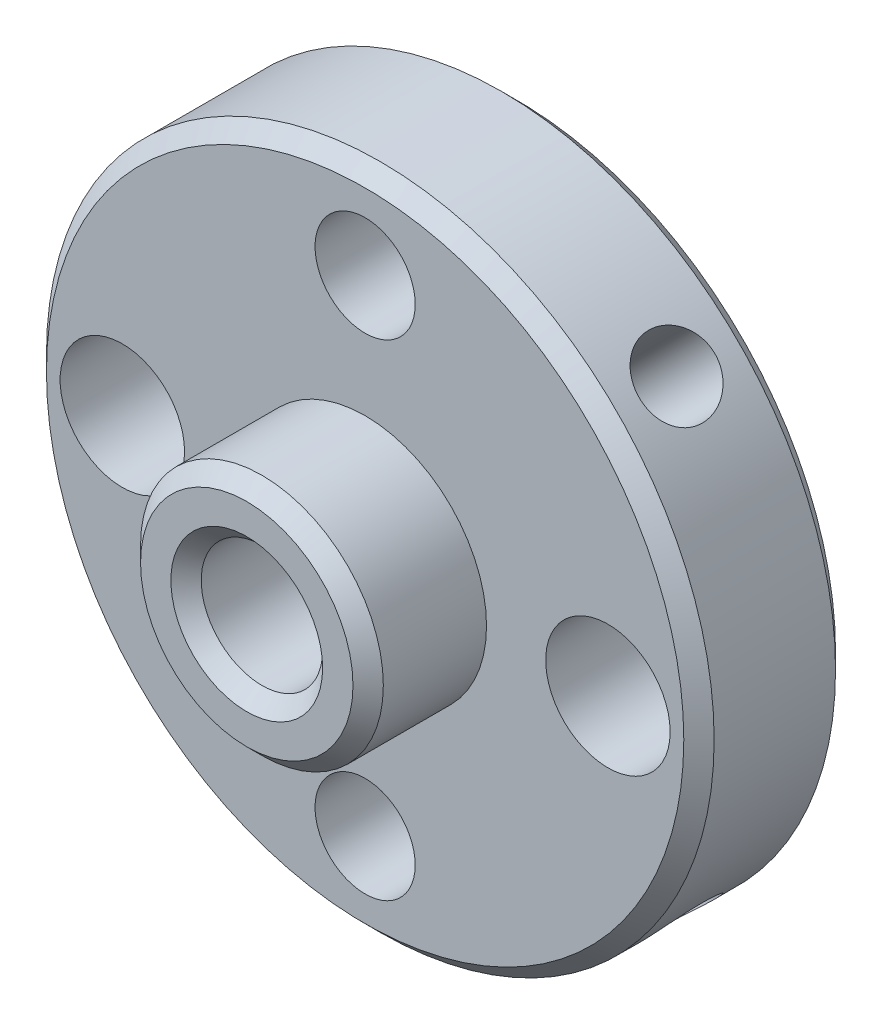
ISO-10303-21;
HEADER;
FILE_DESCRIPTION(('STEP AP214'),'2;1');
FILE_NAME('part.step','',(''),(''),'','','');
FILE_SCHEMA(('AUTOMOTIVE_DESIGN { 1 0 10303 214 1 1 1 1 }'));
ENDSEC;
DATA;
#1=APPLICATION_CONTEXT('core data for automotive mechanical design processes');
#2=APPLICATION_PROTOCOL_DEFINITION('international standard','automotive_design',2000,#1);
#3=PRODUCT_CONTEXT('',#1,'mechanical');
#4=PRODUCT('Part','Part','',(#3));
#5=PRODUCT_RELATED_PRODUCT_CATEGORY('part','',(#4));
#6=PRODUCT_DEFINITION_FORMATION('','',#4);
#7=PRODUCT_DEFINITION_CONTEXT('part definition',#1,'design');
#8=PRODUCT_DEFINITION('design','',#6,#7);
#9=PRODUCT_DEFINITION_SHAPE('','',#8);
#10=(LENGTH_UNIT() NAMED_UNIT(*) SI_UNIT(.MILLI.,.METRE.));
#11=(NAMED_UNIT(*) PLANE_ANGLE_UNIT() SI_UNIT($,.RADIAN.));
#12=(NAMED_UNIT(*) SI_UNIT($,.STERADIAN.) SOLID_ANGLE_UNIT());
#13=UNCERTAINTY_MEASURE_WITH_UNIT(LENGTH_MEASURE(1.E-05),#10,'distance_accuracy_value','');
#14=(GEOMETRIC_REPRESENTATION_CONTEXT(3) GLOBAL_UNCERTAINTY_ASSIGNED_CONTEXT((#13)) GLOBAL_UNIT_ASSIGNED_CONTEXT((#10,
#11,#12)) REPRESENTATION_CONTEXT('',''));
#15=CARTESIAN_POINT('',(0.,0.,0.));
#16=DIRECTION('',(0.,0.,1.));
#17=DIRECTION('',(1.,0.,0.));
#18=AXIS2_PLACEMENT_3D('',#15,#16,#17);
#19=CARTESIAN_POINT('',(0.,0.,8.9));
#20=DIRECTION('',(0.,0.,1.));
#21=DIRECTION('',(1.,0.,0.));
#22=AXIS2_PLACEMENT_3D('',#19,#20,#21);
#23=PLANE('',#22);
#24=CARTESIAN_POINT('',(0.,0.,8.89999999998281));
#25=DIRECTION('',(0.,0.,-1.));
#26=DIRECTION('',(-1.,0.,0.));
#27=AXIS2_PLACEMENT_3D('',#24,#25,#26);
#28=CIRCLE('',#27,3.50000000003092);
#29=CARTESIAN_POINT('',(-3.50000000003092,0.,8.89999999998281));
#30=VERTEX_POINT('',#29);
#31=EDGE_CURVE('E18',#30,#30,#28,.T.);
#32=ORIENTED_EDGE('',*,*,#31,.F.);
#33=EDGE_LOOP('',(#32));
#34=FACE_BOUND('',#33,.T.);
#35=CARTESIAN_POINT('',(0.,0.,8.89999999998281));
#36=DIRECTION('',(0.,0.,1.));
#37=DIRECTION('',(1.,0.,0.));
#38=AXIS2_PLACEMENT_3D('',#35,#36,#37);
#39=CIRCLE('',#38,2.49999999999773);
#40=CARTESIAN_POINT('',(2.49999999999773,0.,8.89999999998281));
#41=VERTEX_POINT('',#40);
#42=EDGE_CURVE('E104',#41,#41,#39,.F.);
#43=ORIENTED_EDGE('',*,*,#42,.T.);
#44=EDGE_LOOP('',(#43));
#45=FACE_BOUND('',#44,.T.);
#46=ADVANCED_FACE('F15',(#34,#45),#23,.T.);
#47=CARTESIAN_POINT('',(0.,0.,8.39999999999463));
#48=DIRECTION('',(0.,0.,-1.));
#49=DIRECTION('',(-1.,0.,0.));
#50=AXIS2_PLACEMENT_3D('',#47,#48,#49);
#51=CONICAL_SURFACE('',#50,4.0000000000191,0.785398163397448);
#52=CARTESIAN_POINT('',(0.,0.,8.4));
#53=DIRECTION('',(0.,0.,-1.));
#54=DIRECTION('',(-1.,0.,0.));
#55=AXIS2_PLACEMENT_3D('',#52,#53,#54);
#56=CIRCLE('',#55,4.);
#57=CARTESIAN_POINT('',(-4.,0.,8.4));
#58=VERTEX_POINT('',#57);
#59=EDGE_CURVE('E30',#58,#58,#56,.T.);
#60=ORIENTED_EDGE('',*,*,#59,.F.);
#61=EDGE_LOOP('',(#60));
#62=FACE_BOUND('',#61,.T.);
#63=ORIENTED_EDGE('',*,*,#31,.T.);
#64=EDGE_LOOP('',(#63));
#65=FACE_BOUND('',#64,.T.);
#66=ADVANCED_FACE('F113',(#62,#65),#51,.T.);
#67=CARTESIAN_POINT('',(0.,0.,8.89999999986912));
#68=DIRECTION('',(0.,0.,1.));
#69=DIRECTION('',(1.,0.,0.));
#70=AXIS2_PLACEMENT_3D('',#67,#68,#69);
#71=CONICAL_SURFACE('',#70,2.49999999988404,0.785398163397448);
#72=ORIENTED_EDGE('',*,*,#42,.F.);
#73=EDGE_LOOP('',(#72));
#74=FACE_BOUND('',#73,.T.);
#75=CARTESIAN_POINT('',(0.,0.,8.4));
#76=DIRECTION('',(0.,0.,1.));
#77=DIRECTION('',(1.,0.,0.));
#78=AXIS2_PLACEMENT_3D('',#75,#76,#77);
#79=CIRCLE('',#78,2.);
#80=CARTESIAN_POINT('',(2.,0.,8.4));
#81=VERTEX_POINT('',#80);
#82=EDGE_CURVE('E167',#81,#81,#79,.F.);
#83=ORIENTED_EDGE('',*,*,#82,.T.);
#84=EDGE_LOOP('',(#83));
#85=FACE_BOUND('',#84,.T.);
#86=ADVANCED_FACE('F109',(#74,#85),#71,.F.);
#87=CARTESIAN_POINT('',(7.77817459305201,7.77817459305204,2.5));
#88=DIRECTION('',(0.707106781186546,0.707106781186549,0.));
#89=DIRECTION('',(-0.707106781186549,0.707106781186546,0.));
#90=AXIS2_PLACEMENT_3D('',#87,#88,#89);
#91=CYLINDRICAL_SURFACE('',#90,1.24999999999999);
#92=CARTESIAN_POINT('',(1.98785358477416,0.220086631807813,2.5));
#93=CARTESIAN_POINT('',(1.98785366262595,0.220086396434667,2.56221959665662));
#94=CARTESIAN_POINT('',(1.98721851007949,0.226067328788089,2.62443848075704));
#95=CARTESIAN_POINT('',(1.98444093960318,0.249244353079412,2.74674364318114));
#96=CARTESIAN_POINT('',(1.98229648800706,0.266455574698358,2.80682692906931));
#97=CARTESIAN_POINT('',(1.97592641609434,0.310147909990793,2.92277925751819));
#98=CARTESIAN_POINT('',(1.97171754801442,0.336553918034612,2.97867811584724));
#99=CARTESIAN_POINT('',(1.96048991276762,0.396756715157924,3.08599532951078));
#100=CARTESIAN_POINT('',(1.95347038959064,0.430555491633809,3.13741247481922));
#101=CARTESIAN_POINT('',(1.93466906674176,0.508804101021884,3.24186645277593));
#102=CARTESIAN_POINT('',(1.92237505660468,0.55407434432446,3.29419662142782));
#103=CARTESIAN_POINT('',(1.89210178936539,0.649988115029603,3.39188415050434));
#104=CARTESIAN_POINT('',(1.87411781290323,0.70063607955813,3.43723567613904));
#105=CARTESIAN_POINT('',(1.82891840096855,0.811834849585339,3.52510360818078));
#106=CARTESIAN_POINT('',(1.80085092411841,0.872843156823016,3.56661766569538));
#107=CARTESIAN_POINT('',(1.73540720167225,0.996616256983764,3.63812518985901));
#108=CARTESIAN_POINT('',(1.69804023184803,1.05937924465938,3.66813006100231));
#109=CARTESIAN_POINT('',(1.61819642772701,1.17727726200222,3.71248229544125));
#110=CARTESIAN_POINT('',(1.5766253519861,1.23253906480697,3.72811139162625));
#111=CARTESIAN_POINT('',(1.4867702522608,1.33954324513706,3.74763206277897));
#112=CARTESIAN_POINT('',(1.43849333024237,1.39128926090542,3.75153595788766));
#113=CARTESIAN_POINT('',(1.34383044182533,1.48251650290186,3.74764430988809));
#114=CARTESIAN_POINT('',(1.2980602568882,1.52271172242853,3.74134861769495));
#115=CARTESIAN_POINT('',(1.20430609973419,1.59789120285444,3.72013300372087));
#116=CARTESIAN_POINT('',(1.15632196230506,1.63287507403973,3.70521243736321));
#117=CARTESIAN_POINT('',(1.05959417643276,1.69724740318654,3.66739628760601));
#118=CARTESIAN_POINT('',(1.01084889410566,1.72662126258092,3.64448032434405));
#119=CARTESIAN_POINT('',(0.914174219288729,1.77969960337929,3.59153146243491));
#120=CARTESIAN_POINT('',(0.866245021128303,1.80340275151225,3.56149689339244));
#121=CARTESIAN_POINT('',(0.76665701106545,1.84812727536504,3.49097080079598));
#122=CARTESIAN_POINT('',(0.715276553415207,1.86844759942965,3.44964301086066));
#123=CARTESIAN_POINT('',(0.61684638135464,1.90321629163828,3.35986520377846));
#124=CARTESIAN_POINT('',(0.569802886883959,1.91765632476747,3.31140520854541));
#125=CARTESIAN_POINT('',(0.476145600503654,1.94317594018885,3.2013034261253));
#126=CARTESIAN_POINT('',(0.430388173820261,1.95357155632872,3.13876673784413));
#127=CARTESIAN_POINT('',(0.349944890729583,1.96957517636009,3.00638005586022));
#128=CARTESIAN_POINT('',(0.31524229591114,1.97519044007864,2.93654133339673));
#129=CARTESIAN_POINT('',(0.266128933961091,1.98233855817972,2.80576326871773));
#130=CARTESIAN_POINT('',(0.249036337738583,1.98446661158903,2.74587252139619));
#131=CARTESIAN_POINT('',(0.226024633386827,1.98722283351844,2.62398515121896));
#132=CARTESIAN_POINT('',(0.220086866320801,1.98785350720688,2.56199222193058));
#133=CARTESIAN_POINT('',(0.220086396434656,1.98785366262595,2.43778040334338));
#134=CARTESIAN_POINT('',(0.226067328788078,1.98721851007949,2.37556151924296));
#135=CARTESIAN_POINT('',(0.249244353079402,1.98444093960319,2.25325635681886));
#136=CARTESIAN_POINT('',(0.266455574698348,1.98229648800707,2.19317307093069));
#137=CARTESIAN_POINT('',(0.310147909990782,1.97592641609435,2.07722074248181));
#138=CARTESIAN_POINT('',(0.336553918034602,1.97171754801442,2.02132188415276));
#139=CARTESIAN_POINT('',(0.396756715157914,1.96048991276762,1.91400467048922));
#140=CARTESIAN_POINT('',(0.430555491633799,1.95347038959064,1.86258752518078));
#141=CARTESIAN_POINT('',(0.508804101021875,1.93466906674176,1.75813354722407));
#142=CARTESIAN_POINT('',(0.554074344324449,1.92237505660468,1.70580337857218));
#143=CARTESIAN_POINT('',(0.649988115029592,1.89210178936539,1.60811584949566));
#144=CARTESIAN_POINT('',(0.70063607955812,1.87411781290323,1.56276432386096));
#145=CARTESIAN_POINT('',(0.811834849585329,1.82891840096856,1.47489639181922));
#146=CARTESIAN_POINT('',(0.872843156823007,1.80085092411842,1.43338233430462));
#147=CARTESIAN_POINT('',(0.996616256983755,1.73540720167226,1.36187481014099));
#148=CARTESIAN_POINT('',(1.05937924465937,1.69804023184804,1.33186993899769));
#149=CARTESIAN_POINT('',(1.17727726200222,1.61819642772701,1.28751770455875));
#150=CARTESIAN_POINT('',(1.23253906480696,1.5766253519861,1.27188860837375));
#151=CARTESIAN_POINT('',(1.33954324513706,1.48677025226081,1.25236793722103));
#152=CARTESIAN_POINT('',(1.39128926090542,1.43849333024238,1.24846404211234));
#153=CARTESIAN_POINT('',(1.48251650290186,1.34383044182533,1.25235569011191));
#154=CARTESIAN_POINT('',(1.52271172242853,1.2980602568882,1.25865138230505));
#155=CARTESIAN_POINT('',(1.59789120285444,1.20430609973419,1.27986699627913));
#156=CARTESIAN_POINT('',(1.63287507403973,1.15632196230507,1.29478756263679));
#157=CARTESIAN_POINT('',(1.69724740318654,1.05959417643277,1.33260371239399));
#158=CARTESIAN_POINT('',(1.72662126258092,1.01084889410566,1.35551967565596));
#159=CARTESIAN_POINT('',(1.77969960337928,0.914174219288738,1.40846853756509));
#160=CARTESIAN_POINT('',(1.80340275151225,0.866245021128311,1.43850310660756));
#161=CARTESIAN_POINT('',(1.84812727536504,0.766657011065459,1.50902919920402));
#162=CARTESIAN_POINT('',(1.86844759942965,0.715276553415215,1.55035698913934));
#163=CARTESIAN_POINT('',(1.90321629163827,0.616846381354649,1.64013479622154));
#164=CARTESIAN_POINT('',(1.91765632476747,0.569802886883968,1.68859479145459));
#165=CARTESIAN_POINT('',(1.94317594018885,0.476145600503664,1.7986965738747));
#166=CARTESIAN_POINT('',(1.95357155632871,0.43038817382027,1.86123326215587));
#167=CARTESIAN_POINT('',(1.96957517636008,0.349944890729592,1.99361994413978));
#168=CARTESIAN_POINT('',(1.97519044007863,0.315242295911149,2.06345866660327));
#169=CARTESIAN_POINT('',(1.98233855817972,0.2661289339611,2.19423673128227));
#170=CARTESIAN_POINT('',(1.98446661158903,0.249036337738592,2.25412747860381));
#171=CARTESIAN_POINT('',(1.98722283351844,0.226024633386837,2.37601484878104));
#172=CARTESIAN_POINT('',(1.98785350720688,0.220086866320812,2.43800777806942));
#173=CARTESIAN_POINT('',(1.98785358477416,0.220086631807813,2.5));
#174=B_SPLINE_CURVE_WITH_KNOTS('',3,(#92,#93,#94,#95,#96,#97,#98,#99,#100,#101,#102,#103,#104,
#105,#106,#107,#108,#109,#110,#111,#112,#113,#114,#115,#116,#117,#118,#119,#120,#121,#122,#123,
#124,#125,#126,#127,#128,#129,#130,#131,#132,#133,#134,#135,#136,#137,#138,#139,#140,#141,#142,
#143,#144,#145,#146,#147,#148,#149,#150,#151,#152,#153,#154,#155,#156,#157,#158,#159,#160,#161,
#162,#163,#164,#165,#166,#167,#168,#169,#170,#171,#172,#173),.UNSPECIFIED.,.T.,.F.,(4,2,2,2,2,2,
2,2,2,2,2,2,2,2,2,2,2,2,2,2,2,2,2,2,2,2,2,2,2,2,2,2,2,2,2,2,2,2,2,2,4),(0.,0.186389987015944,
0.373031602442576,0.558183116284858,0.74338446567946,0.95340973732637,1.1636096663827,
1.3991722883771,1.63450088377995,1.84590391428806,2.05708473727165,2.23992322911808,
2.42277538709733,2.60609707270606,2.78946181778326,2.99565048036044,3.20213039606792,
3.43554174571511,3.66859798254643,3.85461826607747,4.04032711122634,4.22671709824229,
4.41335871366892,4.5985102275112,4.7837115769058,4.99373684855271,5.20393677760904,
5.43949939960344,5.67482799500629,5.8862310255144,6.097411848498,6.28025034034442,
6.46310249832368,6.6464241839324,6.8297889290096,7.03597759158679,7.24245750729426,
7.47586885694145,7.70892509377278,7.89494537730382,8.08065422245269),.UNSPECIFIED.);
#175=CARTESIAN_POINT('',(1.98785358477416,0.220086631807813,2.5));
#176=VERTEX_POINT('',#175);
#177=EDGE_CURVE('E100',#176,#176,#174,.T.);
#178=ORIENTED_EDGE('',*,*,#177,.T.);
#179=EDGE_LOOP('',(#178));
#180=FACE_BOUND('',#179,.T.);
#181=CARTESIAN_POINT('',(8.61167423452003,6.8439072815537,2.5));
#182=CARTESIAN_POINT('',(8.61167271969272,6.8439100773652,2.56990641190171));
#183=CARTESIAN_POINT('',(8.60799011644378,6.84855092906407,2.63990493148656));
#184=CARTESIAN_POINT('',(8.59330901409064,6.86696248705492,2.77800538395691));
#185=CARTESIAN_POINT('',(8.58229522212453,6.88075227783932,2.84610304160004));
#186=CARTESIAN_POINT('',(8.55315922899671,6.91693596188029,2.9783109146247));
#187=CARTESIAN_POINT('',(8.53504436841154,6.93932096952882,3.04242516872769));
#188=CARTESIAN_POINT('',(8.49205535311365,6.99186257954152,3.16490723208015));
#189=CARTESIAN_POINT('',(8.46718407266002,7.02201587690442,3.22327747054889));
#190=CARTESIAN_POINT('',(8.41103739166659,7.08917259849121,3.33292441306264));
#191=CARTESIAN_POINT('',(8.37973526533133,7.12620454588146,3.38416996732927));
#192=CARTESIAN_POINT('',(8.31142376912807,7.20576008184138,3.47784530535193));
#193=CARTESIAN_POINT('',(8.2744138455703,7.24828420311897,3.52027423290521));
#194=CARTESIAN_POINT('',(8.19538187569016,7.33752495840129,3.59521562892058));
#195=CARTESIAN_POINT('',(8.15334655931787,7.38425260805345,3.62770099862342));
#196=CARTESIAN_POINT('',(8.06533403853398,7.4802823549429,3.68165925907401));
#197=CARTESIAN_POINT('',(8.0193569906542,7.52958434991888,3.70313258688953));
#198=CARTESIAN_POINT('',(7.92483850379671,7.62899837221677,3.73436743964353));
#199=CARTESIAN_POINT('',(7.87630903957923,7.67910596401249,3.74417930881866));
#200=CARTESIAN_POINT('',(7.77782654868621,7.77883823902757,3.75196861752708));
#201=CARTESIAN_POINT('',(7.72787356637751,7.82846293723275,3.74994642549225));
#202=CARTESIAN_POINT('',(7.6282214133701,7.92559517675587,3.73416564404987));
#203=CARTESIAN_POINT('',(7.57852213592417,7.97311143730162,3.72046129992177));
#204=CARTESIAN_POINT('',(7.48063970987682,8.06501951685243,3.681789674156));
#205=CARTESIAN_POINT('',(7.43245659937741,8.10941125737138,3.65682210970949));
#206=CARTESIAN_POINT('',(7.33900520382102,8.1940827312762,3.59627325391974));
#207=CARTESIAN_POINT('',(7.29374382046812,8.23435285105003,3.5606678748921));
#208=CARTESIAN_POINT('',(7.20772365864928,8.3097530769042,3.47987472051319));
#209=CARTESIAN_POINT('',(7.1669646830897,8.34488340800149,3.43468736486752));
#210=CARTESIAN_POINT('',(7.0911011526775,8.40944614459884,3.33571763861482));
#211=CARTESIAN_POINT('',(7.0560286910187,8.43884638718189,3.28188967973686));
#212=CARTESIAN_POINT('',(6.99302198105722,8.49113220758406,3.16729186578036));
#213=CARTESIAN_POINT('',(6.96509102339998,8.51401478275929,3.10651882915987));
#214=CARTESIAN_POINT('',(6.91737592178375,8.55282767641342,2.97970228413603));
#215=CARTESIAN_POINT('',(6.89760102240414,8.56875010705149,2.91365289581567));
#216=CARTESIAN_POINT('',(6.86701885185259,8.59327890338271,2.77830493442145));
#217=CARTESIAN_POINT('',(6.8561925712744,8.60190077848496,2.70901358100548));
#218=CARTESIAN_POINT('',(6.8479883547308,8.60842950151804,2.61604459517309));
#219=CARTESIAN_POINT('',(6.84645929660502,8.6096455714004,2.59288156576876));
#220=CARTESIAN_POINT('',(6.84441829500234,8.61126818989666,2.54648241932542));
#221=CARTESIAN_POINT('',(6.84390635184955,8.61167473825258,2.52324630226312));
#222=CARTESIAN_POINT('',(6.84391007736517,8.61167271969275,2.43009358809829));
#223=CARTESIAN_POINT('',(6.84855092906403,8.6079901164438,2.36009506851344));
#224=CARTESIAN_POINT('',(6.86696248705489,8.59330901409066,2.22199461604309));
#225=CARTESIAN_POINT('',(6.88075227783929,8.58229522212455,2.15389695839996));
#226=CARTESIAN_POINT('',(6.91693596188026,8.55315922899673,2.0216890853753));
#227=CARTESIAN_POINT('',(6.93932096952879,8.53504436841157,1.95757483127231));
#228=CARTESIAN_POINT('',(6.99186257954149,8.49205535311368,1.83509276791985));
#229=CARTESIAN_POINT('',(7.02201587690439,8.46718407266004,1.77672252945111));
#230=CARTESIAN_POINT('',(7.08917259849118,8.41103739166662,1.66707558693736));
#231=CARTESIAN_POINT('',(7.12620454588143,8.37973526533136,1.61583003267073));
#232=CARTESIAN_POINT('',(7.20576008184135,8.3114237691281,1.52215469464807));
#233=CARTESIAN_POINT('',(7.24828420311894,8.27441384557033,1.47972576709479));
#234=CARTESIAN_POINT('',(7.33752495840126,8.19538187569018,1.40478437107942));
#235=CARTESIAN_POINT('',(7.38425260805342,8.15334655931789,1.37229900137658));
#236=CARTESIAN_POINT('',(7.48028235494287,8.06533403853401,1.31834074092599));
#237=CARTESIAN_POINT('',(7.52958434991885,8.01935699065423,1.29686741311047));
#238=CARTESIAN_POINT('',(7.62899837221674,7.92483850379674,1.26563256035647));
#239=CARTESIAN_POINT('',(7.67910596401246,7.87630903957925,1.25582069118134));
#240=CARTESIAN_POINT('',(7.77883823902754,7.77782654868624,1.24803138247292));
#241=CARTESIAN_POINT('',(7.82846293723272,7.72787356637754,1.25005357450775));
#242=CARTESIAN_POINT('',(7.92559517675584,7.62822141337013,1.26583435595013));
#243=CARTESIAN_POINT('',(7.97311143730159,7.5785221359242,1.27953870007823));
#244=CARTESIAN_POINT('',(8.0650195168524,7.48063970987685,1.318210325844));
#245=CARTESIAN_POINT('',(8.10941125737135,7.43245659937744,1.34317789029051));
#246=CARTESIAN_POINT('',(8.19408273127617,7.33900520382104,1.40372674608026));
#247=CARTESIAN_POINT('',(8.23435285105001,7.29374382046815,1.4393321251079));
#248=CARTESIAN_POINT('',(8.30975307690418,7.20772365864931,1.52012527948681));
#249=CARTESIAN_POINT('',(8.34488340800146,7.16696468308973,1.56531263513248));
#250=CARTESIAN_POINT('',(8.40944614459881,7.09110115267752,1.66428236138518));
#251=CARTESIAN_POINT('',(8.43884638718186,7.05602869101873,1.71811032026314));
#252=CARTESIAN_POINT('',(8.49113220758403,6.99302198105725,1.83270813421963));
#253=CARTESIAN_POINT('',(8.51401478275926,6.96509102340001,1.89348117084013));
#254=CARTESIAN_POINT('',(8.55282767641339,6.91737592178378,2.02029771586397));
#255=CARTESIAN_POINT('',(8.56875010705146,6.89760102240417,2.08634710418432));
#256=CARTESIAN_POINT('',(8.59327890338268,6.86701885185262,2.22169506557855));
#257=CARTESIAN_POINT('',(8.60190077848494,6.85619257127444,2.29098641899452));
#258=CARTESIAN_POINT('',(8.60842950151801,6.84798835473083,2.38395540482691));
#259=CARTESIAN_POINT('',(8.60964557140038,6.84645929660505,2.40711843423124));
#260=CARTESIAN_POINT('',(8.61126818989663,6.84441829500237,2.45351758067458));
#261=CARTESIAN_POINT('',(8.61167473825256,6.84390635184958,2.47675369773688));
#262=CARTESIAN_POINT('',(8.61167423452003,6.8439072815537,2.5));
#263=B_SPLINE_CURVE_WITH_KNOTS('',3,(#181,#182,#183,#184,#185,#186,#187,#188,#189,#190,#191,
#192,#193,#194,#195,#196,#197,#198,#199,#200,#201,#202,#203,#204,#205,#206,#207,#208,#209,#210,
#211,#212,#213,#214,#215,#216,#217,#218,#219,#220,#221,#222,#223,#224,#225,#226,#227,#228,#229,
#230,#231,#232,#233,#234,#235,#236,#237,#238,#239,#240,#241,#242,#243,#244,#245,#246,#247,#248,
#249,#250,#251,#252,#253,#254,#255,#256,#257,#258,#259,#260,#261,#262),.UNSPECIFIED.,.T.,.F.,(4,
2,2,2,2,2,2,2,2,2,2,2,2,2,2,2,2,2,2,2,2,2,2,2,2,2,2,2,2,2,2,2,2,2,2,2,2,2,2,2,4),(0.,
0.209630667496622,0.419700000784691,0.629552749660832,0.839316364177864,1.04997003527472,
1.26064415387989,1.47188740434643,1.68312226992282,1.8934418520019,2.10375488619969,
2.31309663270018,2.52244363586716,2.73226831264576,2.94208380067214,3.15304505210337,
3.36410333529419,3.57540019184971,3.78624703189034,3.85595646447094,3.92566591926455,
4.13529658676117,4.34536592004924,4.55521866892538,4.76498228344241,4.97563595453927,
5.18631007314443,5.39755332361098,5.60878818918736,5.81910777126645,6.02942080546423,
6.23876255196473,6.4481095551317,6.65793423191031,6.86774971993669,7.07871097136792,
7.28976925455873,7.50106611111425,7.71191295115489,7.78162238373549,7.85133183852909),.UNSPECIFIED.);
#264=CARTESIAN_POINT('',(8.61167423452003,6.8439072815537,2.5));
#265=VERTEX_POINT('',#264);
#266=EDGE_CURVE('E72',#265,#265,#263,.T.);
#267=ORIENTED_EDGE('',*,*,#266,.F.);
#268=EDGE_LOOP('',(#267));
#269=FACE_BOUND('',#268,.T.);
#270=ADVANCED_FACE('F105',(#180,#269),#91,.F.);
#271=CARTESIAN_POINT('',(7.77817459305201,-7.77817459305204,2.5));
#272=DIRECTION('',(0.707106781186546,-0.707106781186549,0.));
#273=DIRECTION('',(0.707106781186549,0.707106781186546,0.));
#274=AXIS2_PLACEMENT_3D('',#271,#272,#273);
#275=CYLINDRICAL_SURFACE('',#274,1.24999999999999);
#276=CARTESIAN_POINT('',(0.220086631807802,-1.98785358477416,2.5));
#277=CARTESIAN_POINT('',(0.220086396434657,-1.98785366262595,2.56221959665662));
#278=CARTESIAN_POINT('',(0.226067328788079,-1.98721851007949,2.62443848075704));
#279=CARTESIAN_POINT('',(0.249244353079401,-1.98444093960319,2.74674364318114));
#280=CARTESIAN_POINT('',(0.266455574698347,-1.98229648800707,2.80682692906931));
#281=CARTESIAN_POINT('',(0.310147909990781,-1.97592641609435,2.92277925751819));
#282=CARTESIAN_POINT('',(0.336553918034601,-1.97171754801442,2.97867811584724));
#283=CARTESIAN_POINT('',(0.396756715157913,-1.96048991276762,3.08599532951078));
#284=CARTESIAN_POINT('',(0.430555491633798,-1.95347038959064,3.13741247481922));
#285=CARTESIAN_POINT('',(0.508804101021874,-1.93466906674176,3.24186645277593));
#286=CARTESIAN_POINT('',(0.554074344324449,-1.92237505660468,3.29419662142782));
#287=CARTESIAN_POINT('',(0.649988115029592,-1.89210178936539,3.39188415050433));
#288=CARTESIAN_POINT('',(0.700636079558119,-1.87411781290323,3.43723567613904));
#289=CARTESIAN_POINT('',(0.811834849585328,-1.82891840096856,3.52510360818078));
#290=CARTESIAN_POINT('',(0.872843156823006,-1.80085092411842,3.56661766569538));
#291=CARTESIAN_POINT('',(0.996616256983754,-1.73540720167226,3.63812518985901));
#292=CARTESIAN_POINT('',(1.05937924465937,-1.69804023184804,3.66813006100231));
#293=CARTESIAN_POINT('',(1.17727726200221,-1.61819642772701,3.71248229544125));
#294=CARTESIAN_POINT('',(1.23253906480696,-1.57662535198611,3.72811139162625));
#295=CARTESIAN_POINT('',(1.33954324513706,-1.48677025226081,3.74763206277897));
#296=CARTESIAN_POINT('',(1.39128926090542,-1.43849333024238,3.75153595788766));
#297=CARTESIAN_POINT('',(1.48251650290186,-1.34383044182533,3.74764430988809));
#298=CARTESIAN_POINT('',(1.52271172242853,-1.2980602568882,3.74134861769495));
#299=CARTESIAN_POINT('',(1.59789120285444,-1.20430609973419,3.72013300372087));
#300=CARTESIAN_POINT('',(1.63287507403973,-1.15632196230507,3.70521243736321));
#301=CARTESIAN_POINT('',(1.69724740318654,-1.05959417643277,3.66739628760602));
#302=CARTESIAN_POINT('',(1.72662126258092,-1.01084889410567,3.64448032434405));
#303=CARTESIAN_POINT('',(1.77969960337928,-0.914174219288739,3.59153146243491));
#304=CARTESIAN_POINT('',(1.80340275151225,-0.866245021128312,3.56149689339244));
#305=CARTESIAN_POINT('',(1.84812727536504,-0.766657011065459,3.49097080079598));
#306=CARTESIAN_POINT('',(1.86844759942965,-0.715276553415216,3.44964301086066));
#307=CARTESIAN_POINT('',(1.90321629163827,-0.61684638135465,3.35986520377846));
#308=CARTESIAN_POINT('',(1.91765632476747,-0.569802886883969,3.31140520854541));
#309=CARTESIAN_POINT('',(1.94317594018885,-0.476145600503664,3.2013034261253));
#310=CARTESIAN_POINT('',(1.95357155632871,-0.43038817382027,3.13876673784414));
#311=CARTESIAN_POINT('',(1.96957517636008,-0.349944890729592,3.00638005586022));
#312=CARTESIAN_POINT('',(1.97519044007863,-0.31524229591115,2.93654133339673));
#313=CARTESIAN_POINT('',(1.98233855817972,-0.266128933961101,2.80576326871773));
#314=CARTESIAN_POINT('',(1.98446661158903,-0.249036337738592,2.74587252139619));
#315=CARTESIAN_POINT('',(1.98722283351844,-0.226024633386836,2.62398515121896));
#316=CARTESIAN_POINT('',(1.98785350720688,-0.220086866320812,2.56199222193058));
#317=CARTESIAN_POINT('',(1.98785366262595,-0.220086396434667,2.43778040334338));
#318=CARTESIAN_POINT('',(1.98721851007949,-0.226067328788088,2.37556151924296));
#319=CARTESIAN_POINT('',(1.98444093960318,-0.249244353079411,2.25325635681886));
#320=CARTESIAN_POINT('',(1.98229648800706,-0.266455574698357,2.19317307093069));
#321=CARTESIAN_POINT('',(1.97592641609434,-0.310147909990792,2.07722074248181));
#322=CARTESIAN_POINT('',(1.97171754801442,-0.336553918034612,2.02132188415276));
#323=CARTESIAN_POINT('',(1.96048991276762,-0.396756715157924,1.91400467048922));
#324=CARTESIAN_POINT('',(1.95347038959064,-0.430555491633809,1.86258752518078));
#325=CARTESIAN_POINT('',(1.93466906674176,-0.508804101021884,1.75813354722407));
#326=CARTESIAN_POINT('',(1.92237505660468,-0.554074344324459,1.70580337857218));
#327=CARTESIAN_POINT('',(1.89210178936539,-0.649988115029603,1.60811584949566));
#328=CARTESIAN_POINT('',(1.87411781290323,-0.70063607955813,1.56276432386096));
#329=CARTESIAN_POINT('',(1.82891840096855,-0.811834849585339,1.47489639181922));
#330=CARTESIAN_POINT('',(1.80085092411841,-0.872843156823017,1.43338233430462));
#331=CARTESIAN_POINT('',(1.73540720167225,-0.996616256983764,1.36187481014098));
#332=CARTESIAN_POINT('',(1.69804023184803,-1.05937924465938,1.33186993899769));
#333=CARTESIAN_POINT('',(1.61819642772701,-1.17727726200222,1.28751770455875));
#334=CARTESIAN_POINT('',(1.5766253519861,-1.23253906480697,1.27188860837375));
#335=CARTESIAN_POINT('',(1.4867702522608,-1.33954324513706,1.25236793722103));
#336=CARTESIAN_POINT('',(1.43849333024237,-1.39128926090542,1.24846404211234));
#337=CARTESIAN_POINT('',(1.34383044182533,-1.48251650290186,1.25235569011191));
#338=CARTESIAN_POINT('',(1.2980602568882,-1.52271172242854,1.25865138230505));
#339=CARTESIAN_POINT('',(1.20430609973419,-1.59789120285444,1.27986699627913));
#340=CARTESIAN_POINT('',(1.15632196230506,-1.63287507403973,1.29478756263679));
#341=CARTESIAN_POINT('',(1.05959417643276,-1.69724740318654,1.33260371239399));
#342=CARTESIAN_POINT('',(1.01084889410566,-1.72662126258092,1.35551967565595));
#343=CARTESIAN_POINT('',(0.914174219288729,-1.77969960337929,1.40846853756509));
#344=CARTESIAN_POINT('',(0.866245021128302,-1.80340275151225,1.43850310660756));
#345=CARTESIAN_POINT('',(0.766657011065449,-1.84812727536504,1.50902919920402));
#346=CARTESIAN_POINT('',(0.715276553415206,-1.86844759942966,1.55035698913934));
#347=CARTESIAN_POINT('',(0.616846381354639,-1.90321629163828,1.64013479622154));
#348=CARTESIAN_POINT('',(0.569802886883958,-1.91765632476747,1.68859479145459));
#349=CARTESIAN_POINT('',(0.476145600503653,-1.94317594018885,1.7986965738747));
#350=CARTESIAN_POINT('',(0.43038817382026,-1.95357155632872,1.86123326215587));
#351=CARTESIAN_POINT('',(0.349944890729582,-1.96957517636009,1.99361994413978));
#352=CARTESIAN_POINT('',(0.315242295911139,-1.97519044007864,2.06345866660327));
#353=CARTESIAN_POINT('',(0.26612893396109,-1.98233855817972,2.19423673128227));
#354=CARTESIAN_POINT('',(0.249036337738582,-1.98446661158903,2.25412747860381));
#355=CARTESIAN_POINT('',(0.226024633386827,-1.98722283351844,2.37601484878104));
#356=CARTESIAN_POINT('',(0.220086866320802,-1.98785350720688,2.43800777806942));
#357=CARTESIAN_POINT('',(0.220086631807802,-1.98785358477416,2.5));
#358=B_SPLINE_CURVE_WITH_KNOTS('',3,(#276,#277,#278,#279,#280,#281,#282,#283,#284,#285,#286,
#287,#288,#289,#290,#291,#292,#293,#294,#295,#296,#297,#298,#299,#300,#301,#302,#303,#304,#305,
#306,#307,#308,#309,#310,#311,#312,#313,#314,#315,#316,#317,#318,#319,#320,#321,#322,#323,#324,
#325,#326,#327,#328,#329,#330,#331,#332,#333,#334,#335,#336,#337,#338,#339,#340,#341,#342,#343,
#344,#345,#346,#347,#348,#349,#350,#351,#352,#353,#354,#355,#356,#357),.UNSPECIFIED.,.T.,.F.,(4,
2,2,2,2,2,2,2,2,2,2,2,2,2,2,2,2,2,2,2,2,2,2,2,2,2,2,2,2,2,2,2,2,2,2,2,2,2,2,2,4),(0.,
0.186389987015944,0.373031602442575,0.558183116284858,0.743384465679459,0.953409737326368,
1.1636096663827,1.3991722883771,1.63450088377995,1.84590391428806,2.05708473727165,
2.23992322911808,2.42277538709733,2.60609707270606,2.78946181778326,2.99565048036045,
3.20213039606792,3.43554174571511,3.66859798254643,3.85461826607748,4.04032711122635,
4.22671709824229,4.41335871366892,4.5985102275112,4.78371157690581,4.99373684855272,
5.20393677760905,5.43949939960344,5.6748279950063,5.8862310255144,6.097411848498,
6.28025034034442,6.46310249832368,6.64642418393241,6.8297889290096,7.03597759158679,
7.24245750729426,7.47586885694146,7.70892509377278,7.89494537730382,8.08065422245269),.UNSPECIFIED.);
#359=CARTESIAN_POINT('',(0.220086631807802,-1.98785358477416,2.5));
#360=VERTEX_POINT('',#359);
#361=EDGE_CURVE('E96',#360,#360,#358,.T.);
#362=ORIENTED_EDGE('',*,*,#361,.T.);
#363=EDGE_LOOP('',(#362));
#364=FACE_BOUND('',#363,.T.);
#365=CARTESIAN_POINT('',(6.84390728155367,-8.61167423452006,2.5));
#366=CARTESIAN_POINT('',(6.84391007736517,-8.61167271969275,2.56990641190171));
#367=CARTESIAN_POINT('',(6.84855092906403,-8.60799011644381,2.63990493148656));
#368=CARTESIAN_POINT('',(6.86696248705489,-8.59330901409066,2.77800538395692));
#369=CARTESIAN_POINT('',(6.88075227783929,-8.58229522212455,2.84610304160004));
#370=CARTESIAN_POINT('',(6.91693596188026,-8.55315922899673,2.9783109146247));
#371=CARTESIAN_POINT('',(6.93932096952879,-8.53504436841157,3.04242516872769));
#372=CARTESIAN_POINT('',(6.99186257954149,-8.49205535311368,3.16490723208016));
#373=CARTESIAN_POINT('',(7.02201587690439,-8.46718407266004,3.22327747054889));
#374=CARTESIAN_POINT('',(7.08917259849119,-8.41103739166662,3.33292441306264));
#375=CARTESIAN_POINT('',(7.12620454588143,-8.37973526533136,3.38416996732927));
#376=CARTESIAN_POINT('',(7.20576008184135,-8.3114237691281,3.47784530535193));
#377=CARTESIAN_POINT('',(7.24828420311894,-8.27441384557033,3.52027423290521));
#378=CARTESIAN_POINT('',(7.33752495840126,-8.19538187569018,3.59521562892058));
#379=CARTESIAN_POINT('',(7.38425260805342,-8.15334655931789,3.62770099862342));
#380=CARTESIAN_POINT('',(7.48028235494287,-8.06533403853401,3.68165925907402));
#381=CARTESIAN_POINT('',(7.52958434991885,-8.01935699065423,3.70313258688953));
#382=CARTESIAN_POINT('',(7.62899837221674,-7.92483850379674,3.73436743964353));
#383=CARTESIAN_POINT('',(7.67910596401247,-7.87630903957925,3.74417930881867));
#384=CARTESIAN_POINT('',(7.77883823902754,-7.77782654868624,3.75196861752708));
#385=CARTESIAN_POINT('',(7.82846293723272,-7.72787356637754,3.74994642549225));
#386=CARTESIAN_POINT('',(7.92559517675584,-7.62822141337013,3.73416564404987));
#387=CARTESIAN_POINT('',(7.97311143730159,-7.5785221359242,3.72046129992177));
#388=CARTESIAN_POINT('',(8.0650195168524,-7.48063970987685,3.681789674156));
#389=CARTESIAN_POINT('',(8.10941125737135,-7.43245659937744,3.65682210970949));
#390=CARTESIAN_POINT('',(8.19408273127618,-7.33900520382104,3.59627325391974));
#391=CARTESIAN_POINT('',(8.23435285105001,-7.29374382046815,3.5606678748921));
#392=CARTESIAN_POINT('',(8.30975307690418,-7.20772365864931,3.47987472051319));
#393=CARTESIAN_POINT('',(8.34488340800147,-7.16696468308973,3.43468736486752));
#394=CARTESIAN_POINT('',(8.40944614459881,-7.09110115267752,3.33571763861482));
#395=CARTESIAN_POINT('',(8.43884638718187,-7.05602869101873,3.28188967973686));
#396=CARTESIAN_POINT('',(8.49113220758404,-6.99302198105725,3.16729186578036));
#397=CARTESIAN_POINT('',(8.51401478275926,-6.96509102340001,3.10651882915987));
#398=CARTESIAN_POINT('',(8.55282767641339,-6.91737592178378,2.97970228413603));
#399=CARTESIAN_POINT('',(8.56875010705146,-6.89760102240417,2.91365289581567));
#400=CARTESIAN_POINT('',(8.59327890338269,-6.86701885185262,2.77830493442145));
#401=CARTESIAN_POINT('',(8.60190077848494,-6.85619257127444,2.70901358100548));
#402=CARTESIAN_POINT('',(8.60842950151801,-6.84798835473083,2.61604459517309));
#403=CARTESIAN_POINT('',(8.60964557140038,-6.84645929660505,2.59288156576876));
#404=CARTESIAN_POINT('',(8.61126818989663,-6.84441829500237,2.54648241932542));
#405=CARTESIAN_POINT('',(8.61167473825256,-6.84390635184958,2.52324630226312));
#406=CARTESIAN_POINT('',(8.61167271969273,-6.8439100773652,2.43009358809829));
#407=CARTESIAN_POINT('',(8.60799011644378,-6.84855092906407,2.36009506851344));
#408=CARTESIAN_POINT('',(8.59330901409064,-6.86696248705492,2.22199461604308));
#409=CARTESIAN_POINT('',(8.58229522212453,-6.88075227783932,2.15389695839996));
#410=CARTESIAN_POINT('',(8.55315922899671,-6.91693596188029,2.0216890853753));
#411=CARTESIAN_POINT('',(8.53504436841154,-6.93932096952882,1.95757483127231));
#412=CARTESIAN_POINT('',(8.49205535311365,-6.99186257954152,1.83509276791985));
#413=CARTESIAN_POINT('',(8.46718407266002,-7.02201587690442,1.77672252945111));
#414=CARTESIAN_POINT('',(8.4110373916666,-7.08917259849122,1.66707558693736));
#415=CARTESIAN_POINT('',(8.37973526533133,-7.12620454588146,1.61583003267073));
#416=CARTESIAN_POINT('',(8.31142376912807,-7.20576008184138,1.52215469464807));
#417=CARTESIAN_POINT('',(8.27441384557031,-7.24828420311897,1.47972576709479));
#418=CARTESIAN_POINT('',(8.19538187569016,-7.33752495840129,1.40478437107942));
#419=CARTESIAN_POINT('',(8.15334655931787,-7.38425260805345,1.37229900137658));
#420=CARTESIAN_POINT('',(8.06533403853398,-7.4802823549429,1.31834074092598));
#421=CARTESIAN_POINT('',(8.0193569906542,-7.52958434991888,1.29686741311047));
#422=CARTESIAN_POINT('',(7.92483850379671,-7.62899837221677,1.26563256035647));
#423=CARTESIAN_POINT('',(7.87630903957923,-7.67910596401249,1.25582069118133));
#424=CARTESIAN_POINT('',(7.77782654868621,-7.77883823902757,1.24803138247292));
#425=CARTESIAN_POINT('',(7.72787356637751,-7.82846293723275,1.25005357450775));
#426=CARTESIAN_POINT('',(7.6282214133701,-7.92559517675587,1.26583435595013));
#427=CARTESIAN_POINT('',(7.57852213592417,-7.97311143730162,1.27953870007823));
#428=CARTESIAN_POINT('',(7.48063970987682,-8.06501951685243,1.318210325844));
#429=CARTESIAN_POINT('',(7.43245659937741,-8.10941125737138,1.34317789029051));
#430=CARTESIAN_POINT('',(7.33900520382101,-8.1940827312762,1.40372674608026));
#431=CARTESIAN_POINT('',(7.29374382046812,-8.23435285105003,1.4393321251079));
#432=CARTESIAN_POINT('',(7.20772365864928,-8.30975307690421,1.52012527948681));
#433=CARTESIAN_POINT('',(7.1669646830897,-8.34488340800149,1.56531263513248));
#434=CARTESIAN_POINT('',(7.09110115267749,-8.40944614459884,1.66428236138519));
#435=CARTESIAN_POINT('',(7.0560286910187,-8.43884638718189,1.71811032026314));
#436=CARTESIAN_POINT('',(6.99302198105722,-8.49113220758406,1.83270813421964));
#437=CARTESIAN_POINT('',(6.96509102339998,-8.51401478275929,1.89348117084013));
#438=CARTESIAN_POINT('',(6.91737592178375,-8.55282767641342,2.02029771586397));
#439=CARTESIAN_POINT('',(6.89760102240414,-8.56875010705149,2.08634710418433));
#440=CARTESIAN_POINT('',(6.86701885185259,-8.59327890338271,2.22169506557855));
#441=CARTESIAN_POINT('',(6.8561925712744,-8.60190077848496,2.29098641899452));
#442=CARTESIAN_POINT('',(6.8479883547308,-8.60842950151804,2.38395540482691));
#443=CARTESIAN_POINT('',(6.84645929660502,-8.6096455714004,2.40711843423124));
#444=CARTESIAN_POINT('',(6.84441829500234,-8.61126818989666,2.45351758067458));
#445=CARTESIAN_POINT('',(6.84390635184955,-8.61167473825258,2.47675369773688));
#446=CARTESIAN_POINT('',(6.84390728155367,-8.61167423452006,2.5));
#447=B_SPLINE_CURVE_WITH_KNOTS('',3,(#365,#366,#367,#368,#369,#370,#371,#372,#373,#374,#375,
#376,#377,#378,#379,#380,#381,#382,#383,#384,#385,#386,#387,#388,#389,#390,#391,#392,#393,#394,
#395,#396,#397,#398,#399,#400,#401,#402,#403,#404,#405,#406,#407,#408,#409,#410,#411,#412,#413,
#414,#415,#416,#417,#418,#419,#420,#421,#422,#423,#424,#425,#426,#427,#428,#429,#430,#431,#432,
#433,#434,#435,#436,#437,#438,#439,#440,#441,#442,#443,#444,#445,#446),.UNSPECIFIED.,.T.,.F.,(4,
2,2,2,2,2,2,2,2,2,2,2,2,2,2,2,2,2,2,2,2,2,2,2,2,2,2,2,2,2,2,2,2,2,2,2,2,2,2,2,4),(0.,
0.209630667496622,0.419700000784692,0.629552749660832,0.839316364177865,1.04997003527472,
1.26064415387989,1.47188740434643,1.68312226992282,1.89344185200191,2.10375488619969,
2.31309663270018,2.52244363586716,2.73226831264577,2.94208380067214,3.15304505210337,
3.36410333529419,3.57540019184971,3.78624703189034,3.85595646447095,3.92566591926455,
4.13529658676117,4.34536592004924,4.55521866892538,4.76498228344241,4.97563595453927,
5.18631007314444,5.39755332361098,5.60878818918737,5.81910777126645,6.02942080546424,
6.23876255196473,6.44810955513171,6.65793423191031,6.86774971993669,7.07871097136792,
7.28976925455874,7.50106611111426,7.71191295115489,7.78162238373549,7.8513318385291),.UNSPECIFIED.);
#448=CARTESIAN_POINT('',(6.84390728155367,-8.61167423452006,2.5));
#449=VERTEX_POINT('',#448);
#450=EDGE_CURVE('E64',#449,#449,#447,.T.);
#451=ORIENTED_EDGE('',*,*,#450,.F.);
#452=EDGE_LOOP('',(#451));
#453=FACE_BOUND('',#452,.T.);
#454=ADVANCED_FACE('F77',(#364,#453),#275,.F.);
#455=CARTESIAN_POINT('',(0.,0.,4.5));
#456=DIRECTION('',(0.,0.,-1.));
#457=DIRECTION('',(-1.,0.,0.));
#458=AXIS2_PLACEMENT_3D('',#455,#456,#457);
#459=CONICAL_SURFACE('',#458,11.,0.785398163397448);
#460=CARTESIAN_POINT('',(0.,0.,4.5));
#461=DIRECTION('',(0.,0.,-1.));
#462=DIRECTION('',(-1.,0.,0.));
#463=AXIS2_PLACEMENT_3D('',#460,#461,#462);
#464=CIRCLE('',#463,11.);
#465=CARTESIAN_POINT('',(-11.,0.,4.5));
#466=VERTEX_POINT('',#465);
#467=EDGE_CURVE('E71',#466,#466,#464,.T.);
#468=ORIENTED_EDGE('',*,*,#467,.F.);
#469=EDGE_LOOP('',(#468));
#470=FACE_BOUND('',#469,.T.);
#471=CARTESIAN_POINT('',(0.,0.,5.));
#472=DIRECTION('',(0.,0.,-1.));
#473=DIRECTION('',(-1.,0.,0.));
#474=AXIS2_PLACEMENT_3D('',#471,#472,#473);
#475=CIRCLE('',#474,10.5);
#476=CARTESIAN_POINT('',(-10.5,0.,5.));
#477=VERTEX_POINT('',#476);
#478=EDGE_CURVE('E61',#477,#477,#475,.F.);
#479=ORIENTED_EDGE('',*,*,#478,.F.);
#480=EDGE_LOOP('',(#479));
#481=FACE_BOUND('',#480,.T.);
#482=ADVANCED_FACE('F183',(#470,#481),#459,.T.);
#483=CARTESIAN_POINT('',(0.,0.,8.9));
#484=DIRECTION('',(0.,0.,-1.));
#485=DIRECTION('',(-1.,0.,0.));
#486=AXIS2_PLACEMENT_3D('',#483,#484,#485);
#487=CYLINDRICAL_SURFACE('',#486,4.);
#488=CARTESIAN_POINT('',(0.,0.,5.));
#489=DIRECTION('',(0.,0.,-1.));
#490=DIRECTION('',(-1.,0.,0.));
#491=AXIS2_PLACEMENT_3D('',#488,#489,#490);
#492=CIRCLE('',#491,4.);
#493=CARTESIAN_POINT('',(-4.,0.,5.));
#494=VERTEX_POINT('',#493);
#495=EDGE_CURVE('E57',#494,#494,#492,.T.);
#496=ORIENTED_EDGE('',*,*,#495,.F.);
#497=EDGE_LOOP('',(#496));
#498=FACE_BOUND('',#497,.T.);
#499=ORIENTED_EDGE('',*,*,#59,.T.);
#500=EDGE_LOOP('',(#499));
#501=FACE_BOUND('',#500,.T.);
#502=ADVANCED_FACE('F93',(#498,#501),#487,.T.);
#503=CARTESIAN_POINT('',(0.,0.,0.));
#504=DIRECTION('',(0.,0.,1.));
#505=DIRECTION('',(1.,0.,0.));
#506=AXIS2_PLACEMENT_3D('',#503,#504,#505);
#507=CYLINDRICAL_SURFACE('',#506,2.);
#508=ORIENTED_EDGE('',*,*,#82,.F.);
#509=EDGE_LOOP('',(#508));
#510=FACE_BOUND('',#509,.T.);
#511=CARTESIAN_POINT('',(0.,0.,0.499999999988177));
#512=DIRECTION('',(0.,0.,-1.));
#513=DIRECTION('',(-1.,0.,0.));
#514=AXIS2_PLACEMENT_3D('',#511,#512,#513);
#515=CIRCLE('',#514,2.00000000000955);
#516=CARTESIAN_POINT('',(-2.00000000000955,0.,0.499999999988177));
#517=VERTEX_POINT('',#516);
#518=EDGE_CURVE('E60',#517,#517,#515,.T.);
#519=ORIENTED_EDGE('',*,*,#518,.T.);
#520=EDGE_LOOP('',(#519));
#521=FACE_BOUND('',#520,.T.);
#522=ORIENTED_EDGE('',*,*,#361,.F.);
#523=EDGE_LOOP('',(#522));
#524=FACE_BOUND('',#523,.T.);
#525=ORIENTED_EDGE('',*,*,#177,.F.);
#526=EDGE_LOOP('',(#525));
#527=FACE_BOUND('',#526,.T.);
#528=ADVANCED_FACE('F86',(#510,#521,#524,#527),#507,.F.);
#529=CARTESIAN_POINT('',(0.,0.,5.));
#530=DIRECTION('',(0.,0.,-1.));
#531=DIRECTION('',(-1.,0.,0.));
#532=AXIS2_PLACEMENT_3D('',#529,#530,#531);
#533=CYLINDRICAL_SURFACE('',#532,11.);
#534=ORIENTED_EDGE('',*,*,#467,.T.);
#535=EDGE_LOOP('',(#534));
#536=FACE_BOUND('',#535,.T.);
#537=ORIENTED_EDGE('',*,*,#450,.T.);
#538=EDGE_LOOP('',(#537));
#539=FACE_BOUND('',#538,.T.);
#540=CARTESIAN_POINT('',(0.,0.,0.500000000000004));
#541=DIRECTION('',(0.,0.,1.));
#542=DIRECTION('',(1.,0.,0.));
#543=AXIS2_PLACEMENT_3D('',#540,#541,#542);
#544=CIRCLE('',#543,11.);
#545=CARTESIAN_POINT('',(11.,0.,0.500000000000004));
#546=VERTEX_POINT('',#545);
#547=EDGE_CURVE('E56',#546,#546,#544,.F.);
#548=ORIENTED_EDGE('',*,*,#547,.F.);
#549=EDGE_LOOP('',(#548));
#550=FACE_BOUND('',#549,.T.);
#551=ORIENTED_EDGE('',*,*,#266,.T.);
#552=EDGE_LOOP('',(#551));
#553=FACE_BOUND('',#552,.T.);
#554=ADVANCED_FACE('F80',(#536,#539,#550,#553),#533,.T.);
#555=CARTESIAN_POINT('',(0.,0.,5.));
#556=DIRECTION('',(0.,0.,1.));
#557=DIRECTION('',(1.,0.,0.));
#558=AXIS2_PLACEMENT_3D('',#555,#556,#557);
#559=PLANE('',#558);
#560=ORIENTED_EDGE('',*,*,#495,.T.);
#561=EDGE_LOOP('',(#560));
#562=FACE_BOUND('',#561,.T.);
#563=CARTESIAN_POINT('',(-8.,0.,5.));
#564=DIRECTION('',(0.,0.,1.));
#565=DIRECTION('',(1.,0.,0.));
#566=AXIS2_PLACEMENT_3D('',#563,#564,#565);
#567=CIRCLE('',#566,2.05);
#568=CARTESIAN_POINT('',(-5.95,0.,5.));
#569=VERTEX_POINT('',#568);
#570=EDGE_CURVE('E44',#569,#569,#567,.F.);
#571=ORIENTED_EDGE('',*,*,#570,.T.);
#572=EDGE_LOOP('',(#571));
#573=FACE_BOUND('',#572,.T.);
#574=CARTESIAN_POINT('',(8.,0.,5.));
#575=DIRECTION('',(0.,0.,1.));
#576=DIRECTION('',(1.,0.,0.));
#577=AXIS2_PLACEMENT_3D('',#574,#575,#576);
#578=CIRCLE('',#577,2.05);
#579=CARTESIAN_POINT('',(10.05,0.,5.));
#580=VERTEX_POINT('',#579);
#581=EDGE_CURVE('E47',#580,#580,#578,.F.);
#582=ORIENTED_EDGE('',*,*,#581,.T.);
#583=EDGE_LOOP('',(#582));
#584=FACE_BOUND('',#583,.T.);
#585=CARTESIAN_POINT('',(0.,-8.,5.));
#586=DIRECTION('',(0.,0.,1.));
#587=DIRECTION('',(1.,0.,0.));
#588=AXIS2_PLACEMENT_3D('',#585,#586,#587);
#589=CIRCLE('',#588,1.64999999999999);
#590=CARTESIAN_POINT('',(1.64999999999999,-8.,5.));
#591=VERTEX_POINT('',#590);
#592=EDGE_CURVE('E50',#591,#591,#589,.F.);
#593=ORIENTED_EDGE('',*,*,#592,.T.);
#594=EDGE_LOOP('',(#593));
#595=FACE_BOUND('',#594,.T.);
#596=CARTESIAN_POINT('',(0.,8.,5.));
#597=DIRECTION('',(0.,0.,1.));
#598=DIRECTION('',(1.,0.,0.));
#599=AXIS2_PLACEMENT_3D('',#596,#597,#598);
#600=CIRCLE('',#599,1.64999999999999);
#601=CARTESIAN_POINT('',(1.64999999999999,8.,5.));
#602=VERTEX_POINT('',#601);
#603=EDGE_CURVE('E53',#602,#602,#600,.F.);
#604=ORIENTED_EDGE('',*,*,#603,.T.);
#605=EDGE_LOOP('',(#604));
#606=FACE_BOUND('',#605,.T.);
#607=ORIENTED_EDGE('',*,*,#478,.T.);
#608=EDGE_LOOP('',(#607));
#609=FACE_BOUND('',#608,.T.);
#610=ADVANCED_FACE('F85',(#562,#573,#584,#595,#606,#609),#559,.T.);
#611=CARTESIAN_POINT('',(0.,0.,0.));
#612=DIRECTION('',(0.,0.,-1.));
#613=DIRECTION('',(-1.,0.,0.));
#614=AXIS2_PLACEMENT_3D('',#611,#612,#613);
#615=CONICAL_SURFACE('',#614,2.49999999999773,0.785398163397448);
#616=CARTESIAN_POINT('',(0.,0.,0.));
#617=DIRECTION('',(0.,0.,-1.));
#618=DIRECTION('',(-1.,0.,0.));
#619=AXIS2_PLACEMENT_3D('',#616,#617,#618);
#620=CIRCLE('',#619,2.49999999999773);
#621=CARTESIAN_POINT('',(-2.49999999999773,0.,0.));
#622=VERTEX_POINT('',#621);
#623=EDGE_CURVE('E41',#622,#622,#620,.T.);
#624=ORIENTED_EDGE('',*,*,#623,.T.);
#625=EDGE_LOOP('',(#624));
#626=FACE_BOUND('',#625,.T.);
#627=ORIENTED_EDGE('',*,*,#518,.F.);
#628=EDGE_LOOP('',(#627));
#629=FACE_BOUND('',#628,.T.);
#630=ADVANCED_FACE('F149',(#626,#629),#615,.F.);
#631=CARTESIAN_POINT('',(0.,0.,0.500000000000004));
#632=DIRECTION('',(0.,0.,1.));
#633=DIRECTION('',(1.,0.,0.));
#634=AXIS2_PLACEMENT_3D('',#631,#632,#633);
#635=CONICAL_SURFACE('',#634,11.,0.785398163397453);
#636=CARTESIAN_POINT('',(0.,0.,0.));
#637=DIRECTION('',(0.,0.,1.));
#638=DIRECTION('',(1.,0.,0.));
#639=AXIS2_PLACEMENT_3D('',#636,#637,#638);
#640=CIRCLE('',#639,10.5);
#641=CARTESIAN_POINT('',(10.5,0.,0.));
#642=VERTEX_POINT('',#641);
#643=EDGE_CURVE('E38',#642,#642,#640,.T.);
#644=ORIENTED_EDGE('',*,*,#643,.T.);
#645=EDGE_LOOP('',(#644));
#646=FACE_BOUND('',#645,.T.);
#647=ORIENTED_EDGE('',*,*,#547,.T.);
#648=EDGE_LOOP('',(#647));
#649=FACE_BOUND('',#648,.T.);
#650=ADVANCED_FACE('F146',(#646,#649),#635,.T.);
#651=CARTESIAN_POINT('',(0.,8.,5.));
#652=DIRECTION('',(0.,0.,1.));
#653=DIRECTION('',(1.,0.,0.));
#654=AXIS2_PLACEMENT_3D('',#651,#652,#653);
#655=CYLINDRICAL_SURFACE('',#654,1.64999999999999);
#656=CARTESIAN_POINT('',(0.,8.,0.));
#657=DIRECTION('',(0.,0.,1.));
#658=DIRECTION('',(1.,0.,0.));
#659=AXIS2_PLACEMENT_3D('',#656,#657,#658);
#660=CIRCLE('',#659,1.64999999999999);
#661=CARTESIAN_POINT('',(1.64999999999999,8.,0.));
#662=VERTEX_POINT('',#661);
#663=EDGE_CURVE('E35',#662,#662,#660,.F.);
#664=ORIENTED_EDGE('',*,*,#663,.T.);
#665=EDGE_LOOP('',(#664));
#666=FACE_BOUND('',#665,.T.);
#667=ORIENTED_EDGE('',*,*,#603,.F.);
#668=EDGE_LOOP('',(#667));
#669=FACE_BOUND('',#668,.T.);
#670=ADVANCED_FACE('F142',(#666,#669),#655,.F.);
#671=CARTESIAN_POINT('',(0.,-8.,5.));
#672=DIRECTION('',(0.,0.,1.));
#673=DIRECTION('',(1.,0.,0.));
#674=AXIS2_PLACEMENT_3D('',#671,#672,#673);
#675=CYLINDRICAL_SURFACE('',#674,1.64999999999999);
#676=CARTESIAN_POINT('',(0.,-8.,0.));
#677=DIRECTION('',(0.,0.,1.));
#678=DIRECTION('',(1.,0.,0.));
#679=AXIS2_PLACEMENT_3D('',#676,#677,#678);
#680=CIRCLE('',#679,1.64999999999999);
#681=CARTESIAN_POINT('',(1.64999999999999,-8.,0.));
#682=VERTEX_POINT('',#681);
#683=EDGE_CURVE('E27',#682,#682,#680,.F.);
#684=ORIENTED_EDGE('',*,*,#683,.T.);
#685=EDGE_LOOP('',(#684));
#686=FACE_BOUND('',#685,.T.);
#687=ORIENTED_EDGE('',*,*,#592,.F.);
#688=EDGE_LOOP('',(#687));
#689=FACE_BOUND('',#688,.T.);
#690=ADVANCED_FACE('F138',(#686,#689),#675,.F.);
#691=CARTESIAN_POINT('',(8.,0.,0.));
#692=DIRECTION('',(0.,0.,1.));
#693=DIRECTION('',(1.,0.,0.));
#694=AXIS2_PLACEMENT_3D('',#691,#692,#693);
#695=CYLINDRICAL_SURFACE('',#694,2.05);
#696=CARTESIAN_POINT('',(8.,0.,0.));
#697=DIRECTION('',(0.,0.,1.));
#698=DIRECTION('',(1.,0.,0.));
#699=AXIS2_PLACEMENT_3D('',#696,#697,#698);
#700=CIRCLE('',#699,2.05);
#701=CARTESIAN_POINT('',(10.05,0.,0.));
#702=VERTEX_POINT('',#701);
#703=EDGE_CURVE('E22',#702,#702,#700,.F.);
#704=ORIENTED_EDGE('',*,*,#703,.T.);
#705=EDGE_LOOP('',(#704));
#706=FACE_BOUND('',#705,.T.);
#707=ORIENTED_EDGE('',*,*,#581,.F.);
#708=EDGE_LOOP('',(#707));
#709=FACE_BOUND('',#708,.T.);
#710=ADVANCED_FACE('F132',(#706,#709),#695,.F.);
#711=CARTESIAN_POINT('',(-8.,0.,0.));
#712=DIRECTION('',(0.,0.,1.));
#713=DIRECTION('',(1.,0.,0.));
#714=AXIS2_PLACEMENT_3D('',#711,#712,#713);
#715=CYLINDRICAL_SURFACE('',#714,2.05);
#716=CARTESIAN_POINT('',(-8.,0.,0.));
#717=DIRECTION('',(0.,0.,1.));
#718=DIRECTION('',(1.,0.,0.));
#719=AXIS2_PLACEMENT_3D('',#716,#717,#718);
#720=CIRCLE('',#719,2.05);
#721=CARTESIAN_POINT('',(-5.95,0.,0.));
#722=VERTEX_POINT('',#721);
#723=EDGE_CURVE('E9',#722,#722,#720,.F.);
#724=ORIENTED_EDGE('',*,*,#723,.T.);
#725=EDGE_LOOP('',(#724));
#726=FACE_BOUND('',#725,.T.);
#727=ORIENTED_EDGE('',*,*,#570,.F.);
#728=EDGE_LOOP('',(#727));
#729=FACE_BOUND('',#728,.T.);
#730=ADVANCED_FACE('F126',(#726,#729),#715,.F.);
#731=CARTESIAN_POINT('',(0.,0.,0.));
#732=DIRECTION('',(0.,0.,1.));
#733=DIRECTION('',(1.,0.,0.));
#734=AXIS2_PLACEMENT_3D('',#731,#732,#733);
#735=PLANE('',#734);
#736=ORIENTED_EDGE('',*,*,#723,.F.);
#737=EDGE_LOOP('',(#736));
#738=FACE_BOUND('',#737,.T.);
#739=ORIENTED_EDGE('',*,*,#703,.F.);
#740=EDGE_LOOP('',(#739));
#741=FACE_BOUND('',#740,.T.);
#742=ORIENTED_EDGE('',*,*,#683,.F.);
#743=EDGE_LOOP('',(#742));
#744=FACE_BOUND('',#743,.T.);
#745=ORIENTED_EDGE('',*,*,#663,.F.);
#746=EDGE_LOOP('',(#745));
#747=FACE_BOUND('',#746,.T.);
#748=ORIENTED_EDGE('',*,*,#643,.F.);
#749=EDGE_LOOP('',(#748));
#750=FACE_BOUND('',#749,.T.);
#751=ORIENTED_EDGE('',*,*,#623,.F.);
#752=EDGE_LOOP('',(#751));
#753=FACE_BOUND('',#752,.T.);
#754=ADVANCED_FACE('F124',(#738,#741,#744,#747,#750,#753),#735,.F.);
#755=CLOSED_SHELL('',(#46,#66,#86,#270,#454,#482,#502,#528,#554,#610,#630,#650,#670,#690,#710,
#730,#754));
#756=MANIFOLD_SOLID_BREP('B1',#755);
#757=ADVANCED_BREP_SHAPE_REPRESENTATION('',(#18,#756),#14);
#758=SHAPE_DEFINITION_REPRESENTATION(#9,#757);
ENDSEC;
END-ISO-10303-21;
